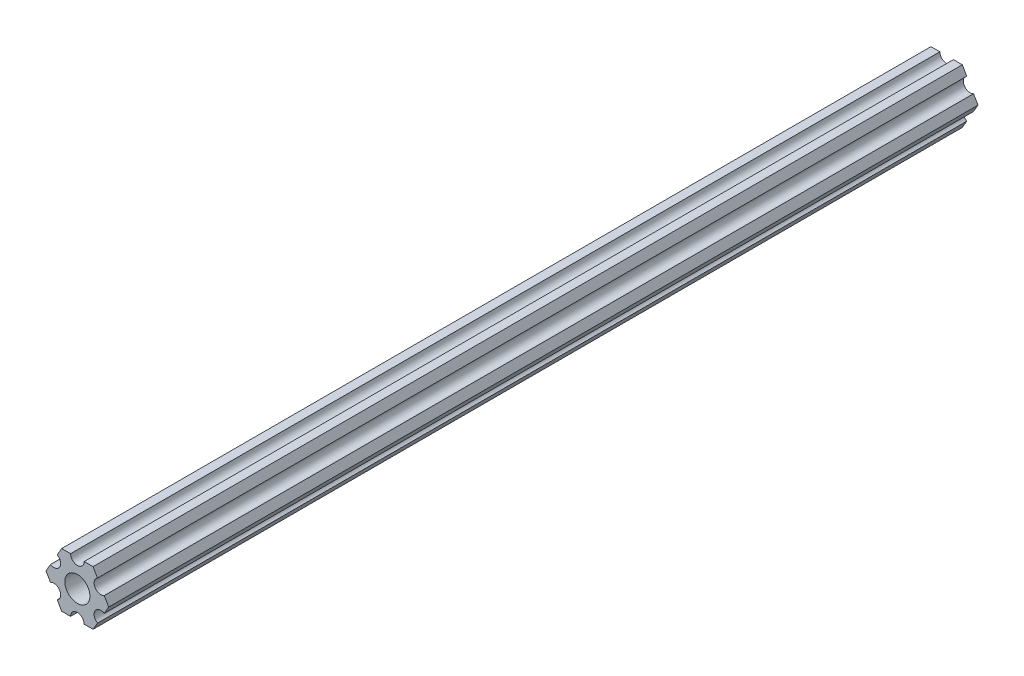
ISO-10303-21;
HEADER;
FILE_DESCRIPTION(('STEP AP214'),'2;1');
FILE_NAME('part.step','',(''),(''),'','','');
FILE_SCHEMA(('AUTOMOTIVE_DESIGN { 1 0 10303 214 1 1 1 1 }'));
ENDSEC;
DATA;
#1=APPLICATION_CONTEXT('core data for automotive mechanical design processes');
#2=APPLICATION_PROTOCOL_DEFINITION('international standard','automotive_design',2000,#1);
#3=PRODUCT_CONTEXT('',#1,'mechanical');
#4=PRODUCT('Part','Part','',(#3));
#5=PRODUCT_RELATED_PRODUCT_CATEGORY('part','',(#4));
#6=PRODUCT_DEFINITION_FORMATION('','',#4);
#7=PRODUCT_DEFINITION_CONTEXT('part definition',#1,'design');
#8=PRODUCT_DEFINITION('design','',#6,#7);
#9=PRODUCT_DEFINITION_SHAPE('','',#8);
#10=(LENGTH_UNIT() NAMED_UNIT(*) SI_UNIT(.MILLI.,.METRE.));
#11=(NAMED_UNIT(*) PLANE_ANGLE_UNIT() SI_UNIT($,.RADIAN.));
#12=(NAMED_UNIT(*) SI_UNIT($,.STERADIAN.) SOLID_ANGLE_UNIT());
#13=UNCERTAINTY_MEASURE_WITH_UNIT(LENGTH_MEASURE(1.E-05),#10,'distance_accuracy_value','');
#14=(GEOMETRIC_REPRESENTATION_CONTEXT(3) GLOBAL_UNCERTAINTY_ASSIGNED_CONTEXT((#13)) GLOBAL_UNIT_ASSIGNED_CONTEXT((#10,
#11,#12)) REPRESENTATION_CONTEXT('',''));
#15=CARTESIAN_POINT('',(0.,0.,0.));
#16=DIRECTION('',(0.,0.,1.));
#17=DIRECTION('',(1.,0.,0.));
#18=AXIS2_PLACEMENT_3D('',#15,#16,#17);
#19=CARTESIAN_POINT('',(-5.49926150638083,-3.17499966684068,-203.2));
#20=DIRECTION('',(0.,0.,1.));
#21=DIRECTION('',(1.,0.,0.));
#22=AXIS2_PLACEMENT_3D('',#19,#20,#21);
#23=CYLINDRICAL_SURFACE('',#22,1.58750000000001);
#24=CARTESIAN_POINT('',(-5.49926150638083,-3.17499966684068,0.));
#25=DIRECTION('',(0.,0.,-1.));
#26=DIRECTION('',(-1.,0.,0.));
#27=AXIS2_PLACEMENT_3D('',#24,#25,#26);
#28=CIRCLE('',#27,1.58750000000001);
#29=CARTESIAN_POINT('',(-6.29301142309098,-1.80018429024546,0.));
#30=VERTEX_POINT('',#29);
#31=CARTESIAN_POINT('',(-4.70551158967068,-4.54981504343589,0.));
#32=VERTEX_POINT('',#31);
#33=EDGE_CURVE('E194',#30,#32,#28,.T.);
#34=ORIENTED_EDGE('',*,*,#33,.F.);
#35=DIRECTION('',(0.,0.,1.));
#36=VECTOR('',#35,1.);
#37=CARTESIAN_POINT('',(-6.29301142309098,-1.80018429024546,-203.2));
#38=LINE('',#37,#36);
#39=CARTESIAN_POINT('',(-6.29301142309098,-1.80018429024546,-203.2));
#40=VERTEX_POINT('',#39);
#41=EDGE_CURVE('E11',#40,#30,#38,.T.);
#42=ORIENTED_EDGE('',*,*,#41,.F.);
#43=CARTESIAN_POINT('',(-5.49926150638083,-3.17499966684068,-203.2));
#44=DIRECTION('',(0.,0.,-1.));
#45=DIRECTION('',(-1.,0.,0.));
#46=AXIS2_PLACEMENT_3D('',#43,#44,#45);
#47=CIRCLE('',#46,1.58750000000001);
#48=CARTESIAN_POINT('',(-4.70551158967068,-4.54981504343589,-203.2));
#49=VERTEX_POINT('',#48);
#50=EDGE_CURVE('E245',#40,#49,#47,.T.);
#51=ORIENTED_EDGE('',*,*,#50,.T.);
#52=DIRECTION('',(0.,0.,1.));
#53=VECTOR('',#52,1.);
#54=CARTESIAN_POINT('',(-4.70551158967068,-4.54981504343589,-203.2));
#55=LINE('',#54,#53);
#56=EDGE_CURVE('E40',#49,#32,#55,.T.);
#57=ORIENTED_EDGE('',*,*,#56,.T.);
#58=EDGE_LOOP('',(#34,#42,#51,#57));
#59=FACE_BOUND('',#58,.T.);
#60=ADVANCED_FACE('F37',(#59),#23,.F.);
#61=CARTESIAN_POINT('',(-7.33234841870826,4.44212518856872E-07,-203.2));
#62=DIRECTION('',(-0.866025434075723,-0.499999947533953,0.));
#63=DIRECTION('',(0.499999947533953,-0.866025434075723,0.));
#64=AXIS2_PLACEMENT_3D('',#61,#62,#63);
#65=PLANE('',#64);
#66=DIRECTION('',(0.499999947533953,-0.866025434075723,0.));
#67=VECTOR('',#66,1.);
#68=CARTESIAN_POINT('',(-7.33234841870826,4.44212518856872E-07,0.));
#69=LINE('',#68,#67);
#70=CARTESIAN_POINT('',(-7.33234841870826,4.44212518856872E-07,0.));
#71=VERTEX_POINT('',#70);
#72=EDGE_CURVE('E243',#71,#30,#69,.T.);
#73=ORIENTED_EDGE('',*,*,#72,.F.);
#74=DIRECTION('',(0.,0.,1.));
#75=VECTOR('',#74,1.);
#76=CARTESIAN_POINT('',(-7.33234841870826,4.44212518856872E-07,-203.2));
#77=LINE('',#76,#75);
#78=CARTESIAN_POINT('',(-7.33234841870826,4.44212518856872E-07,-203.2));
#79=VERTEX_POINT('',#78);
#80=EDGE_CURVE('E46',#79,#71,#77,.T.);
#81=ORIENTED_EDGE('',*,*,#80,.F.);
#82=DIRECTION('',(0.499999947533953,-0.866025434075723,0.));
#83=VECTOR('',#82,1.);
#84=CARTESIAN_POINT('',(-7.33234841870826,4.44212518856872E-07,-203.2));
#85=LINE('',#84,#83);
#86=EDGE_CURVE('E184',#79,#40,#85,.T.);
#87=ORIENTED_EDGE('',*,*,#86,.T.);
#88=ORIENTED_EDGE('',*,*,#41,.T.);
#89=EDGE_LOOP('',(#73,#81,#87,#88));
#90=FACE_BOUND('',#89,.T.);
#91=ADVANCED_FACE('F277',(#90),#65,.T.);
#92=CARTESIAN_POINT('',(-6.29301120497139,1.80018505273895,-203.2));
#93=DIRECTION('',(-0.866025373493145,0.500000052466056,0.));
#94=DIRECTION('',(-0.500000052466056,-0.866025373493145,0.));
#95=AXIS2_PLACEMENT_3D('',#92,#93,#94);
#96=PLANE('',#95);
#97=DIRECTION('',(-0.500000052466056,-0.866025373493145,0.));
#98=VECTOR('',#97,1.);
#99=CARTESIAN_POINT('',(-6.29301120497139,1.80018505273895,0.));
#100=LINE('',#99,#98);
#101=CARTESIAN_POINT('',(-6.29301120497139,1.80018505273895,0.));
#102=VERTEX_POINT('',#101);
#103=EDGE_CURVE('E171',#102,#71,#100,.T.);
#104=ORIENTED_EDGE('',*,*,#103,.F.);
#105=DIRECTION('',(0.,0.,1.));
#106=VECTOR('',#105,1.);
#107=CARTESIAN_POINT('',(-6.29301120497139,1.80018505273895,-203.2));
#108=LINE('',#107,#106);
#109=CARTESIAN_POINT('',(-6.29301120497139,1.80018505273895,-203.2));
#110=VERTEX_POINT('',#109);
#111=EDGE_CURVE('E166',#110,#102,#108,.T.);
#112=ORIENTED_EDGE('',*,*,#111,.F.);
#113=DIRECTION('',(-0.500000052466056,-0.866025373493145,0.));
#114=VECTOR('',#113,1.);
#115=CARTESIAN_POINT('',(-6.29301120497139,1.80018505273895,-203.2));
#116=LINE('',#115,#114);
#117=EDGE_CURVE('E169',#110,#79,#116,.T.);
#118=ORIENTED_EDGE('',*,*,#117,.T.);
#119=ORIENTED_EDGE('',*,*,#80,.T.);
#120=EDGE_LOOP('',(#104,#112,#118,#119));
#121=FACE_BOUND('',#120,.T.);
#122=ADVANCED_FACE('F168',(#121),#96,.T.);
#123=CARTESIAN_POINT('',(-5.49926112168152,3.17500033315931,-203.2));
#124=DIRECTION('',(0.,0.,1.));
#125=DIRECTION('',(1.,0.,0.));
#126=AXIS2_PLACEMENT_3D('',#123,#124,#125);
#127=CYLINDRICAL_SURFACE('',#126,1.5875);
#128=CARTESIAN_POINT('',(-5.49926112168152,3.17500033315931,0.));
#129=DIRECTION('',(0.,0.,-1.));
#130=DIRECTION('',(-1.,0.,0.));
#131=AXIS2_PLACEMENT_3D('',#128,#129,#130);
#132=CIRCLE('',#131,1.5875);
#133=CARTESIAN_POINT('',(-4.70551103839166,4.54981561357968,0.));
#134=VERTEX_POINT('',#133);
#135=EDGE_CURVE('E240',#134,#102,#132,.T.);
#136=ORIENTED_EDGE('',*,*,#135,.F.);
#137=DIRECTION('',(0.,0.,1.));
#138=VECTOR('',#137,1.);
#139=CARTESIAN_POINT('',(-4.70551103839166,4.54981561357968,-203.2));
#140=LINE('',#139,#138);
#141=CARTESIAN_POINT('',(-4.70551103839166,4.54981561357968,-203.2));
#142=VERTEX_POINT('',#141);
#143=EDGE_CURVE('E176',#142,#134,#140,.T.);
#144=ORIENTED_EDGE('',*,*,#143,.F.);
#145=CARTESIAN_POINT('',(-5.49926112168152,3.17500033315931,-203.2));
#146=DIRECTION('',(0.,0.,-1.));
#147=DIRECTION('',(-1.,0.,0.));
#148=AXIS2_PLACEMENT_3D('',#145,#146,#147);
#149=CIRCLE('',#148,1.5875);
#150=EDGE_CURVE('E182',#142,#110,#149,.T.);
#151=ORIENTED_EDGE('',*,*,#150,.T.);
#152=ORIENTED_EDGE('',*,*,#111,.T.);
#153=EDGE_LOOP('',(#136,#144,#151,#152));
#154=FACE_BOUND('',#153,.T.);
#155=ADVANCED_FACE('F186',(#154),#127,.F.);
#156=CARTESIAN_POINT('',(-3.66617382465472,6.35000022210622,-203.2));
#157=DIRECTION('',(-0.866025373493145,0.500000052466056,0.));
#158=DIRECTION('',(-0.500000052466056,-0.866025373493145,0.));
#159=AXIS2_PLACEMENT_3D('',#156,#157,#158);
#160=PLANE('',#159);
#161=DIRECTION('',(-0.500000052466056,-0.866025373493145,0.));
#162=VECTOR('',#161,1.);
#163=CARTESIAN_POINT('',(-3.66617382465472,6.35000022210622,0.));
#164=LINE('',#163,#162);
#165=CARTESIAN_POINT('',(-3.66617382465472,6.35000022210622,0.));
#166=VERTEX_POINT('',#165);
#167=EDGE_CURVE('E237',#166,#134,#164,.T.);
#168=ORIENTED_EDGE('',*,*,#167,.F.);
#169=DIRECTION('',(0.,0.,1.));
#170=VECTOR('',#169,1.);
#171=CARTESIAN_POINT('',(-3.66617382465472,6.35000022210622,-203.2));
#172=LINE('',#171,#170);
#173=CARTESIAN_POINT('',(-3.66617382465472,6.35000022210622,-203.2));
#174=VERTEX_POINT('',#173);
#175=EDGE_CURVE('E249',#174,#166,#172,.T.);
#176=ORIENTED_EDGE('',*,*,#175,.F.);
#177=DIRECTION('',(-0.500000052466056,-0.866025373493145,0.));
#178=VECTOR('',#177,1.);
#179=CARTESIAN_POINT('',(-3.66617382465472,6.35000022210622,-203.2));
#180=LINE('',#179,#178);
#181=EDGE_CURVE('E187',#174,#142,#180,.T.);
#182=ORIENTED_EDGE('',*,*,#181,.T.);
#183=ORIENTED_EDGE('',*,*,#143,.T.);
#184=EDGE_LOOP('',(#168,#176,#182,#183));
#185=FACE_BOUND('',#184,.T.);
#186=ADVANCED_FACE('F290',(#185),#160,.T.);
#187=CARTESIAN_POINT('',(-1.58749884590197,6.35000022210623,-203.2));
#188=DIRECTION('',(0.,1.,0.));
#189=DIRECTION('',(-1.,0.,0.));
#190=AXIS2_PLACEMENT_3D('',#187,#188,#189);
#191=PLANE('',#190);
#192=DIRECTION('',(-1.,0.,0.));
#193=VECTOR('',#192,1.);
#194=CARTESIAN_POINT('',(-1.58749884590197,6.35000022210623,0.));
#195=LINE('',#194,#193);
#196=CARTESIAN_POINT('',(-1.58749884590197,6.35000022210623,0.));
#197=VERTEX_POINT('',#196);
#198=EDGE_CURVE('E234',#197,#166,#195,.T.);
#199=ORIENTED_EDGE('',*,*,#198,.F.);
#200=DIRECTION('',(0.,0.,1.));
#201=VECTOR('',#200,1.);
#202=CARTESIAN_POINT('',(-1.58749884590197,6.35000022210623,-203.2));
#203=LINE('',#202,#201);
#204=CARTESIAN_POINT('',(-1.58749884590197,6.35000022210623,-203.2));
#205=VERTEX_POINT('',#204);
#206=EDGE_CURVE('E251',#205,#197,#203,.T.);
#207=ORIENTED_EDGE('',*,*,#206,.F.);
#208=DIRECTION('',(-1.,0.,0.));
#209=VECTOR('',#208,1.);
#210=CARTESIAN_POINT('',(-1.58749884590197,6.35000022210623,-203.2));
#211=LINE('',#210,#209);
#212=EDGE_CURVE('E189',#205,#174,#211,.T.);
#213=ORIENTED_EDGE('',*,*,#212,.T.);
#214=ORIENTED_EDGE('',*,*,#175,.T.);
#215=EDGE_LOOP('',(#199,#207,#213,#214));
#216=FACE_BOUND('',#215,.T.);
#217=ADVANCED_FACE('F293',(#216),#191,.T.);
#218=CARTESIAN_POINT('',(3.84699344941095E-07,6.35000022210623,-203.2));
#219=DIRECTION('',(0.,0.,1.));
#220=DIRECTION('',(1.,0.,0.));
#221=AXIS2_PLACEMENT_3D('',#218,#219,#220);
#222=CYLINDRICAL_SURFACE('',#221,1.58749884590197);
#223=CARTESIAN_POINT('',(3.84699344941095E-07,6.35000022210623,0.));
#224=DIRECTION('',(0.,0.,-1.));
#225=DIRECTION('',(-1.,0.,0.));
#226=AXIS2_PLACEMENT_3D('',#223,#224,#225);
#227=CIRCLE('',#226,1.58749884590197);
#228=CARTESIAN_POINT('',(1.58749923060131,6.35000022210623,0.));
#229=VERTEX_POINT('',#228);
#230=EDGE_CURVE('E231',#229,#197,#227,.T.);
#231=ORIENTED_EDGE('',*,*,#230,.F.);
#232=DIRECTION('',(0.,0.,1.));
#233=VECTOR('',#232,1.);
#234=CARTESIAN_POINT('',(1.58749923060131,6.35000022210623,-203.2));
#235=LINE('',#234,#233);
#236=CARTESIAN_POINT('',(1.58749923060131,6.35000022210623,-203.2));
#237=VERTEX_POINT('',#236);
#238=EDGE_CURVE('E253',#237,#229,#235,.T.);
#239=ORIENTED_EDGE('',*,*,#238,.F.);
#240=CARTESIAN_POINT('',(3.84699344941095E-07,6.35000022210623,-203.2));
#241=DIRECTION('',(0.,0.,-1.));
#242=DIRECTION('',(-1.,0.,0.));
#243=AXIS2_PLACEMENT_3D('',#240,#241,#242);
#244=CIRCLE('',#243,1.58749884590197);
#245=EDGE_CURVE('E398',#237,#205,#244,.T.);
#246=ORIENTED_EDGE('',*,*,#245,.T.);
#247=ORIENTED_EDGE('',*,*,#206,.T.);
#248=EDGE_LOOP('',(#231,#239,#246,#247));
#249=FACE_BOUND('',#248,.T.);
#250=ADVANCED_FACE('F297',(#249),#222,.F.);
#251=CARTESIAN_POINT('',(3.66617452134701,6.35000022210623,-203.2));
#252=DIRECTION('',(0.,1.,0.));
#253=DIRECTION('',(-1.,0.,0.));
#254=AXIS2_PLACEMENT_3D('',#251,#252,#253);
#255=PLANE('',#254);
#256=DIRECTION('',(-1.,0.,0.));
#257=VECTOR('',#256,1.);
#258=CARTESIAN_POINT('',(3.66617452134701,6.35000022210623,0.));
#259=LINE('',#258,#257);
#260=CARTESIAN_POINT('',(3.66617452134701,6.35000022210623,0.));
#261=VERTEX_POINT('',#260);
#262=EDGE_CURVE('E228',#261,#229,#259,.T.);
#263=ORIENTED_EDGE('',*,*,#262,.F.);
#264=DIRECTION('',(0.,0.,1.));
#265=VECTOR('',#264,1.);
#266=CARTESIAN_POINT('',(3.66617452134701,6.35000022210623,-203.2));
#267=LINE('',#266,#265);
#268=CARTESIAN_POINT('',(3.66617452134701,6.35000022210623,-203.2));
#269=VERTEX_POINT('',#268);
#270=EDGE_CURVE('E255',#269,#261,#267,.T.);
#271=ORIENTED_EDGE('',*,*,#270,.F.);
#272=DIRECTION('',(-1.,0.,0.));
#273=VECTOR('',#272,1.);
#274=CARTESIAN_POINT('',(3.66617452134701,6.35000022210623,-203.2));
#275=LINE('',#274,#273);
#276=EDGE_CURVE('E395',#269,#237,#275,.T.);
#277=ORIENTED_EDGE('',*,*,#276,.T.);
#278=ORIENTED_EDGE('',*,*,#238,.T.);
#279=EDGE_LOOP('',(#263,#271,#277,#278));
#280=FACE_BOUND('',#279,.T.);
#281=ADVANCED_FACE('F301',(#280),#255,.T.);
#282=CARTESIAN_POINT('',(4.70551142760333,4.54981551649452,-203.2));
#283=DIRECTION('',(0.866025449221368,0.499999921300922,0.));
#284=DIRECTION('',(-0.499999921300922,0.866025449221368,0.));
#285=AXIS2_PLACEMENT_3D('',#282,#283,#284);
#286=PLANE('',#285);
#287=DIRECTION('',(-0.499999921300922,0.866025449221368,0.));
#288=VECTOR('',#287,1.);
#289=CARTESIAN_POINT('',(4.70551142760333,4.54981551649452,0.));
#290=LINE('',#289,#288);
#291=CARTESIAN_POINT('',(4.70551142760333,4.54981551649452,0.));
#292=VERTEX_POINT('',#291);
#293=EDGE_CURVE('E225',#292,#261,#290,.T.);
#294=ORIENTED_EDGE('',*,*,#293,.F.);
#295=DIRECTION('',(0.,0.,1.));
#296=VECTOR('',#295,1.);
#297=CARTESIAN_POINT('',(4.70551142760333,4.54981551649452,-203.2));
#298=LINE('',#297,#296);
#299=CARTESIAN_POINT('',(4.70551142760333,4.54981551649452,-203.2));
#300=VERTEX_POINT('',#299);
#301=EDGE_CURVE('E257',#300,#292,#298,.T.);
#302=ORIENTED_EDGE('',*,*,#301,.F.);
#303=DIRECTION('',(-0.499999921300922,0.866025449221368,0.));
#304=VECTOR('',#303,1.);
#305=CARTESIAN_POINT('',(4.70551142760333,4.54981551649452,-203.2));
#306=LINE('',#305,#304);
#307=EDGE_CURVE('E392',#300,#269,#306,.T.);
#308=ORIENTED_EDGE('',*,*,#307,.T.);
#309=ORIENTED_EDGE('',*,*,#270,.T.);
#310=EDGE_LOOP('',(#294,#302,#308,#309));
#311=FACE_BOUND('',#310,.T.);
#312=ADVANCED_FACE('F305',(#311),#286,.T.);
#313=CARTESIAN_POINT('',(5.49926130266854,3.1750001158556,-203.2));
#314=DIRECTION('',(0.,0.,1.));
#315=DIRECTION('',(1.,0.,0.));
#316=AXIS2_PLACEMENT_3D('',#313,#314,#315);
#317=CYLINDRICAL_SURFACE('',#316,1.5875);
#318=CARTESIAN_POINT('',(5.49926130266854,3.1750001158556,0.));
#319=DIRECTION('',(0.,0.,-1.));
#320=DIRECTION('',(-1.,0.,0.));
#321=AXIS2_PLACEMENT_3D('',#318,#319,#320);
#322=CIRCLE('',#321,1.5875);
#323=CARTESIAN_POINT('',(6.29301117773375,1.80018471521667,0.));
#324=VERTEX_POINT('',#323);
#325=EDGE_CURVE('E222',#324,#292,#322,.T.);
#326=ORIENTED_EDGE('',*,*,#325,.F.);
#327=DIRECTION('',(0.,0.,1.));
#328=VECTOR('',#327,1.);
#329=CARTESIAN_POINT('',(6.29301117773375,1.80018471521667,-203.2));
#330=LINE('',#329,#328);
#331=CARTESIAN_POINT('',(6.29301117773375,1.80018471521667,-203.2));
#332=VERTEX_POINT('',#331);
#333=EDGE_CURVE('E259',#332,#324,#330,.T.);
#334=ORIENTED_EDGE('',*,*,#333,.F.);
#335=CARTESIAN_POINT('',(5.49926130266854,3.1750001158556,-203.2));
#336=DIRECTION('',(0.,0.,-1.));
#337=DIRECTION('',(-1.,0.,0.));
#338=AXIS2_PLACEMENT_3D('',#335,#336,#337);
#339=CIRCLE('',#338,1.5875);
#340=EDGE_CURVE('E389',#332,#300,#339,.T.);
#341=ORIENTED_EDGE('',*,*,#340,.T.);
#342=ORIENTED_EDGE('',*,*,#301,.T.);
#343=EDGE_LOOP('',(#326,#334,#341,#342));
#344=FACE_BOUND('',#343,.T.);
#345=ADVANCED_FACE('F309',(#344),#317,.F.);
#346=CARTESIAN_POINT('',(7.33234803400895,9.61748368946088E-08,-203.2));
#347=DIRECTION('',(0.866025449221368,0.499999921300922,0.));
#348=DIRECTION('',(-0.499999921300922,0.866025449221368,0.));
#349=AXIS2_PLACEMENT_3D('',#346,#347,#348);
#350=PLANE('',#349);
#351=DIRECTION('',(-0.499999921300922,0.866025449221368,0.));
#352=VECTOR('',#351,1.);
#353=CARTESIAN_POINT('',(7.33234803400895,9.61748368946088E-08,0.));
#354=LINE('',#353,#352);
#355=CARTESIAN_POINT('',(7.33234803400895,9.61748368946088E-08,0.));
#356=VERTEX_POINT('',#355);
#357=EDGE_CURVE('E219',#356,#324,#354,.T.);
#358=ORIENTED_EDGE('',*,*,#357,.F.);
#359=DIRECTION('',(0.,0.,1.));
#360=VECTOR('',#359,1.);
#361=CARTESIAN_POINT('',(7.33234803400895,9.61748368946088E-08,-203.2));
#362=LINE('',#361,#360);
#363=CARTESIAN_POINT('',(7.33234803400895,9.61748368946088E-08,-203.2));
#364=VERTEX_POINT('',#363);
#365=EDGE_CURVE('E261',#364,#356,#362,.T.);
#366=ORIENTED_EDGE('',*,*,#365,.F.);
#367=DIRECTION('',(-0.499999921300922,0.866025449221368,0.));
#368=VECTOR('',#367,1.);
#369=CARTESIAN_POINT('',(7.33234803400895,9.61748368946088E-08,-203.2));
#370=LINE('',#369,#368);
#371=EDGE_CURVE('E386',#364,#332,#370,.T.);
#372=ORIENTED_EDGE('',*,*,#371,.T.);
#373=ORIENTED_EDGE('',*,*,#333,.T.);
#374=EDGE_LOOP('',(#358,#366,#372,#373));
#375=FACE_BOUND('',#374,.T.);
#376=ADVANCED_FACE('F313',(#375),#350,.T.);
#377=CARTESIAN_POINT('',(6.29301092933191,-1.80018457531732,-203.2));
#378=DIRECTION('',(0.866025403784438,-0.5,0.));
#379=DIRECTION('',(0.5,0.866025403784438,0.));
#380=AXIS2_PLACEMENT_3D('',#377,#378,#379);
#381=PLANE('',#380);
#382=DIRECTION('',(0.5,0.866025403784438,0.));
#383=VECTOR('',#382,1.);
#384=CARTESIAN_POINT('',(6.29301092933191,-1.80018457531732,0.));
#385=LINE('',#384,#383);
#386=CARTESIAN_POINT('',(6.29301092933191,-1.80018457531732,0.));
#387=VERTEX_POINT('',#386);
#388=EDGE_CURVE('E216',#387,#356,#385,.T.);
#389=ORIENTED_EDGE('',*,*,#388,.F.);
#390=DIRECTION('',(0.,0.,1.));
#391=VECTOR('',#390,1.);
#392=CARTESIAN_POINT('',(6.29301092933191,-1.80018457531732,-203.2));
#393=LINE('',#392,#391);
#394=CARTESIAN_POINT('',(6.29301092933191,-1.80018457531732,-203.2));
#395=VERTEX_POINT('',#394);
#396=EDGE_CURVE('E263',#395,#387,#393,.T.);
#397=ORIENTED_EDGE('',*,*,#396,.F.);
#398=DIRECTION('',(0.5,0.866025403784438,0.));
#399=VECTOR('',#398,1.);
#400=CARTESIAN_POINT('',(6.29301092933191,-1.80018457531732,-203.2));
#401=LINE('',#400,#399);
#402=EDGE_CURVE('E383',#395,#364,#401,.T.);
#403=ORIENTED_EDGE('',*,*,#402,.T.);
#404=ORIENTED_EDGE('',*,*,#365,.T.);
#405=EDGE_LOOP('',(#389,#397,#403,#404));
#406=FACE_BOUND('',#405,.T.);
#407=ADVANCED_FACE('F317',(#406),#381,.T.);
#408=CARTESIAN_POINT('',(5.49926092933191,-3.17499990382512,-203.2));
#409=DIRECTION('',(0.,0.,1.));
#410=DIRECTION('',(1.,0.,0.));
#411=AXIS2_PLACEMENT_3D('',#408,#409,#410);
#412=CYLINDRICAL_SURFACE('',#411,1.5875);
#413=CARTESIAN_POINT('',(5.49926092933191,-3.17499990382512,0.));
#414=DIRECTION('',(0.,0.,-1.));
#415=DIRECTION('',(-1.,0.,0.));
#416=AXIS2_PLACEMENT_3D('',#413,#414,#415);
#417=CIRCLE('',#416,1.5875);
#418=CARTESIAN_POINT('',(4.70551092933191,-4.54981523233291,0.));
#419=VERTEX_POINT('',#418);
#420=EDGE_CURVE('E213',#419,#387,#417,.T.);
#421=ORIENTED_EDGE('',*,*,#420,.F.);
#422=DIRECTION('',(0.,0.,1.));
#423=VECTOR('',#422,1.);
#424=CARTESIAN_POINT('',(4.70551092933191,-4.54981523233291,-203.2));
#425=LINE('',#424,#423);
#426=CARTESIAN_POINT('',(4.70551092933191,-4.54981523233291,-203.2));
#427=VERTEX_POINT('',#426);
#428=EDGE_CURVE('E265',#427,#419,#425,.T.);
#429=ORIENTED_EDGE('',*,*,#428,.F.);
#430=CARTESIAN_POINT('',(5.49926092933191,-3.17499990382512,-203.2));
#431=DIRECTION('',(0.,0.,-1.));
#432=DIRECTION('',(-1.,0.,0.));
#433=AXIS2_PLACEMENT_3D('',#430,#431,#432);
#434=CIRCLE('',#433,1.5875);
#435=EDGE_CURVE('E380',#427,#395,#434,.T.);
#436=ORIENTED_EDGE('',*,*,#435,.T.);
#437=ORIENTED_EDGE('',*,*,#396,.T.);
#438=EDGE_LOOP('',(#421,#429,#436,#437));
#439=FACE_BOUND('',#438,.T.);
#440=ADVANCED_FACE('F321',(#439),#412,.F.);
#441=CARTESIAN_POINT('',(3.66617382465481,-6.34999990382519,-203.2));
#442=DIRECTION('',(0.866025403784438,-0.5,0.));
#443=DIRECTION('',(0.5,0.866025403784439,0.));
#444=AXIS2_PLACEMENT_3D('',#441,#442,#443);
#445=PLANE('',#444);
#446=DIRECTION('',(0.5,0.866025403784439,0.));
#447=VECTOR('',#446,1.);
#448=CARTESIAN_POINT('',(3.66617382465481,-6.34999990382519,0.));
#449=LINE('',#448,#447);
#450=CARTESIAN_POINT('',(3.66617382465481,-6.34999990382519,0.));
#451=VERTEX_POINT('',#450);
#452=EDGE_CURVE('E210',#451,#419,#449,.T.);
#453=ORIENTED_EDGE('',*,*,#452,.F.);
#454=DIRECTION('',(0.,0.,1.));
#455=VECTOR('',#454,1.);
#456=CARTESIAN_POINT('',(3.66617382465481,-6.34999990382519,-203.2));
#457=LINE('',#456,#455);
#458=CARTESIAN_POINT('',(3.66617382465481,-6.34999990382519,-203.2));
#459=VERTEX_POINT('',#458);
#460=EDGE_CURVE('E267',#459,#451,#457,.T.);
#461=ORIENTED_EDGE('',*,*,#460,.F.);
#462=DIRECTION('',(0.5,0.866025403784439,0.));
#463=VECTOR('',#462,1.);
#464=CARTESIAN_POINT('',(3.66617382465481,-6.34999990382519,-203.2));
#465=LINE('',#464,#463);
#466=EDGE_CURVE('E377',#459,#427,#465,.T.);
#467=ORIENTED_EDGE('',*,*,#466,.T.);
#468=ORIENTED_EDGE('',*,*,#428,.T.);
#469=EDGE_LOOP('',(#453,#461,#467,#468));
#470=FACE_BOUND('',#469,.T.);
#471=ADVANCED_FACE('F325',(#470),#445,.T.);
#472=CARTESIAN_POINT('',(1.58750115409778,-6.34999990382519,-203.2));
#473=DIRECTION('',(0.,-1.,0.));
#474=DIRECTION('',(1.,0.,0.));
#475=AXIS2_PLACEMENT_3D('',#472,#473,#474);
#476=PLANE('',#475);
#477=DIRECTION('',(1.,0.,0.));
#478=VECTOR('',#477,1.);
#479=CARTESIAN_POINT('',(1.58750115409778,-6.34999990382519,0.));
#480=LINE('',#479,#478);
#481=CARTESIAN_POINT('',(1.58750115409778,-6.34999990382519,0.));
#482=VERTEX_POINT('',#481);
#483=EDGE_CURVE('E207',#482,#451,#480,.T.);
#484=ORIENTED_EDGE('',*,*,#483,.F.);
#485=DIRECTION('',(0.,0.,1.));
#486=VECTOR('',#485,1.);
#487=CARTESIAN_POINT('',(1.58750115409778,-6.34999990382519,-203.2));
#488=LINE('',#487,#486);
#489=CARTESIAN_POINT('',(1.58750115409778,-6.34999990382519,-203.2));
#490=VERTEX_POINT('',#489);
#491=EDGE_CURVE('E269',#490,#482,#488,.T.);
#492=ORIENTED_EDGE('',*,*,#491,.F.);
#493=DIRECTION('',(1.,0.,0.));
#494=VECTOR('',#493,1.);
#495=CARTESIAN_POINT('',(1.58750115409778,-6.34999990382519,-203.2));
#496=LINE('',#495,#494);
#497=EDGE_CURVE('E374',#490,#459,#496,.T.);
#498=ORIENTED_EDGE('',*,*,#497,.T.);
#499=ORIENTED_EDGE('',*,*,#460,.T.);
#500=EDGE_LOOP('',(#484,#492,#498,#499));
#501=FACE_BOUND('',#500,.T.);
#502=ADVANCED_FACE('F329',(#501),#476,.T.);
#503=CARTESIAN_POINT('',(-3.8469926204343E-07,-6.34999990382519,-203.2));
#504=DIRECTION('',(0.,0.,1.));
#505=DIRECTION('',(1.,0.,0.));
#506=AXIS2_PLACEMENT_3D('',#503,#504,#505);
#507=CYLINDRICAL_SURFACE('',#506,1.58750115409778);
#508=CARTESIAN_POINT('',(-3.8469926204343E-07,-6.34999990382519,0.));
#509=DIRECTION('',(0.,0.,-1.));
#510=DIRECTION('',(-1.,0.,0.));
#511=AXIS2_PLACEMENT_3D('',#508,#509,#510);
#512=CIRCLE('',#511,1.58750115409778);
#513=CARTESIAN_POINT('',(-1.58750153879705,-6.34999990382519,0.));
#514=VERTEX_POINT('',#513);
#515=EDGE_CURVE('E204',#514,#482,#512,.T.);
#516=ORIENTED_EDGE('',*,*,#515,.F.);
#517=DIRECTION('',(0.,0.,1.));
#518=VECTOR('',#517,1.);
#519=CARTESIAN_POINT('',(-1.58750153879705,-6.34999990382519,-203.2));
#520=LINE('',#519,#518);
#521=CARTESIAN_POINT('',(-1.58750153879705,-6.34999990382519,-203.2));
#522=VERTEX_POINT('',#521);
#523=EDGE_CURVE('E271',#522,#514,#520,.T.);
#524=ORIENTED_EDGE('',*,*,#523,.F.);
#525=CARTESIAN_POINT('',(-3.8469926204343E-07,-6.34999990382519,-203.2));
#526=DIRECTION('',(0.,0.,-1.));
#527=DIRECTION('',(-1.,0.,0.));
#528=AXIS2_PLACEMENT_3D('',#525,#526,#527);
#529=CIRCLE('',#528,1.58750115409778);
#530=EDGE_CURVE('E371',#522,#490,#529,.T.);
#531=ORIENTED_EDGE('',*,*,#530,.T.);
#532=ORIENTED_EDGE('',*,*,#491,.T.);
#533=EDGE_LOOP('',(#516,#524,#531,#532));
#534=FACE_BOUND('',#533,.T.);
#535=ADVANCED_FACE('F333',(#534),#507,.F.);
#536=CARTESIAN_POINT('',(-3.66617452134693,-6.34999990382519,-203.2));
#537=DIRECTION('',(0.,-1.,0.));
#538=DIRECTION('',(1.,0.,0.));
#539=AXIS2_PLACEMENT_3D('',#536,#537,#538);
#540=PLANE('',#539);
#541=DIRECTION('',(1.,0.,0.));
#542=VECTOR('',#541,1.);
#543=CARTESIAN_POINT('',(-3.66617452134693,-6.34999990382519,0.));
#544=LINE('',#543,#542);
#545=CARTESIAN_POINT('',(-3.66617452134693,-6.34999990382519,0.));
#546=VERTEX_POINT('',#545);
#547=EDGE_CURVE('E201',#546,#514,#544,.T.);
#548=ORIENTED_EDGE('',*,*,#547,.F.);
#549=DIRECTION('',(0.,0.,1.));
#550=VECTOR('',#549,1.);
#551=CARTESIAN_POINT('',(-3.66617452134693,-6.34999990382519,-203.2));
#552=LINE('',#551,#550);
#553=CARTESIAN_POINT('',(-3.66617452134693,-6.34999990382519,-203.2));
#554=VERTEX_POINT('',#553);
#555=EDGE_CURVE('E272',#554,#546,#552,.T.);
#556=ORIENTED_EDGE('',*,*,#555,.F.);
#557=DIRECTION('',(1.,0.,0.));
#558=VECTOR('',#557,1.);
#559=CARTESIAN_POINT('',(-3.66617452134693,-6.34999990382519,-203.2));
#560=LINE('',#559,#558);
#561=EDGE_CURVE('E368',#554,#522,#560,.T.);
#562=ORIENTED_EDGE('',*,*,#561,.T.);
#563=ORIENTED_EDGE('',*,*,#523,.T.);
#564=EDGE_LOOP('',(#548,#556,#562,#563));
#565=FACE_BOUND('',#564,.T.);
#566=ADVANCED_FACE('F337',(#565),#540,.T.);
#567=CARTESIAN_POINT('',(-4.70551158967068,-4.54981504343589,-203.2));
#568=DIRECTION('',(-0.866025434075723,-0.499999947533953,0.));
#569=DIRECTION('',(0.499999947533953,-0.866025434075723,0.));
#570=AXIS2_PLACEMENT_3D('',#567,#568,#569);
#571=PLANE('',#570);
#572=DIRECTION('',(0.499999947533953,-0.866025434075723,0.));
#573=VECTOR('',#572,1.);
#574=CARTESIAN_POINT('',(-4.70551158967068,-4.54981504343589,0.));
#575=LINE('',#574,#573);
#576=EDGE_CURVE('E197',#32,#546,#575,.T.);
#577=ORIENTED_EDGE('',*,*,#576,.F.);
#578=ORIENTED_EDGE('',*,*,#56,.F.);
#579=DIRECTION('',(0.499999947533953,-0.866025434075723,0.));
#580=VECTOR('',#579,1.);
#581=CARTESIAN_POINT('',(-4.70551158967068,-4.54981504343589,-203.2));
#582=LINE('',#581,#580);
#583=EDGE_CURVE('E366',#49,#554,#582,.T.);
#584=ORIENTED_EDGE('',*,*,#583,.T.);
#585=ORIENTED_EDGE('',*,*,#555,.T.);
#586=EDGE_LOOP('',(#577,#578,#584,#585));
#587=FACE_BOUND('',#586,.T.);
#588=ADVANCED_FACE('F274',(#587),#571,.T.);
#589=CARTESIAN_POINT('',(-5.49926150638083,-3.17499966684068,-203.2));
#590=DIRECTION('',(0.,0.,-1.));
#591=DIRECTION('',(-1.,0.,0.));
#592=AXIS2_PLACEMENT_3D('',#589,#590,#591);
#593=PLANE('',#592);
#594=CARTESIAN_POINT('',(0.,0.,-203.2));
#595=DIRECTION('',(0.,0.,1.));
#596=DIRECTION('',(-1.,0.,0.));
#597=AXIS2_PLACEMENT_3D('',#594,#595,#596);
#598=CIRCLE('',#597,2.9337);
#599=CARTESIAN_POINT('',(-2.9337,0.,-203.2));
#600=VERTEX_POINT('',#599);
#601=EDGE_CURVE('E198',#600,#600,#598,.T.);
#602=ORIENTED_EDGE('',*,*,#601,.T.);
#603=EDGE_LOOP('',(#602));
#604=FACE_BOUND('',#603,.T.);
#605=ORIENTED_EDGE('',*,*,#50,.F.);
#606=ORIENTED_EDGE('',*,*,#86,.F.);
#607=ORIENTED_EDGE('',*,*,#117,.F.);
#608=ORIENTED_EDGE('',*,*,#150,.F.);
#609=ORIENTED_EDGE('',*,*,#181,.F.);
#610=ORIENTED_EDGE('',*,*,#212,.F.);
#611=ORIENTED_EDGE('',*,*,#245,.F.);
#612=ORIENTED_EDGE('',*,*,#276,.F.);
#613=ORIENTED_EDGE('',*,*,#307,.F.);
#614=ORIENTED_EDGE('',*,*,#340,.F.);
#615=ORIENTED_EDGE('',*,*,#371,.F.);
#616=ORIENTED_EDGE('',*,*,#402,.F.);
#617=ORIENTED_EDGE('',*,*,#435,.F.);
#618=ORIENTED_EDGE('',*,*,#466,.F.);
#619=ORIENTED_EDGE('',*,*,#497,.F.);
#620=ORIENTED_EDGE('',*,*,#530,.F.);
#621=ORIENTED_EDGE('',*,*,#561,.F.);
#622=ORIENTED_EDGE('',*,*,#583,.F.);
#623=EDGE_LOOP('',(#605,#606,#607,#608,#609,#610,#611,#612,#613,#614,#615,#616,#617,#618,#619,
#620,#621,#622));
#624=FACE_BOUND('',#623,.T.);
#625=ADVANCED_FACE('F180',(#604,#624),#593,.T.);
#626=CARTESIAN_POINT('',(-5.49926150638083,-3.17499966684068,0.));
#627=DIRECTION('',(0.,0.,-1.));
#628=DIRECTION('',(-1.,0.,0.));
#629=AXIS2_PLACEMENT_3D('',#626,#627,#628);
#630=PLANE('',#629);
#631=CARTESIAN_POINT('',(0.,0.,0.));
#632=DIRECTION('',(0.,0.,1.));
#633=DIRECTION('',(-1.,0.,0.));
#634=AXIS2_PLACEMENT_3D('',#631,#632,#633);
#635=CIRCLE('',#634,2.9337);
#636=CARTESIAN_POINT('',(-2.9337,0.,0.));
#637=VERTEX_POINT('',#636);
#638=EDGE_CURVE('E361',#637,#637,#635,.T.);
#639=ORIENTED_EDGE('',*,*,#638,.F.);
#640=EDGE_LOOP('',(#639));
#641=FACE_BOUND('',#640,.T.);
#642=ORIENTED_EDGE('',*,*,#33,.T.);
#643=ORIENTED_EDGE('',*,*,#576,.T.);
#644=ORIENTED_EDGE('',*,*,#547,.T.);
#645=ORIENTED_EDGE('',*,*,#515,.T.);
#646=ORIENTED_EDGE('',*,*,#483,.T.);
#647=ORIENTED_EDGE('',*,*,#452,.T.);
#648=ORIENTED_EDGE('',*,*,#420,.T.);
#649=ORIENTED_EDGE('',*,*,#388,.T.);
#650=ORIENTED_EDGE('',*,*,#357,.T.);
#651=ORIENTED_EDGE('',*,*,#325,.T.);
#652=ORIENTED_EDGE('',*,*,#293,.T.);
#653=ORIENTED_EDGE('',*,*,#262,.T.);
#654=ORIENTED_EDGE('',*,*,#230,.T.);
#655=ORIENTED_EDGE('',*,*,#198,.T.);
#656=ORIENTED_EDGE('',*,*,#167,.T.);
#657=ORIENTED_EDGE('',*,*,#135,.T.);
#658=ORIENTED_EDGE('',*,*,#103,.T.);
#659=ORIENTED_EDGE('',*,*,#72,.T.);
#660=EDGE_LOOP('',(#642,#643,#644,#645,#646,#647,#648,#649,#650,#651,#652,#653,#654,#655,#656,
#657,#658,#659));
#661=FACE_BOUND('',#660,.T.);
#662=ADVANCED_FACE('F276',(#641,#661),#630,.F.);
#663=CARTESIAN_POINT('',(0.,0.,-203.2));
#664=DIRECTION('',(0.,0.,1.));
#665=DIRECTION('',(1.,0.,0.));
#666=AXIS2_PLACEMENT_3D('',#663,#664,#665);
#667=CYLINDRICAL_SURFACE('',#666,2.9337);
#668=ORIENTED_EDGE('',*,*,#601,.F.);
#669=EDGE_LOOP('',(#668));
#670=FACE_BOUND('',#669,.T.);
#671=ORIENTED_EDGE('',*,*,#638,.T.);
#672=EDGE_LOOP('',(#671));
#673=FACE_BOUND('',#672,.T.);
#674=ADVANCED_FACE('F349',(#670,#673),#667,.F.);
#675=CLOSED_SHELL('',(#60,#91,#122,#155,#186,#217,#250,#281,#312,#345,#376,#407,#440,#471,#502,
#535,#566,#588,#625,#662,#674));
#676=MANIFOLD_SOLID_BREP('B2',#675);
#677=ADVANCED_BREP_SHAPE_REPRESENTATION('',(#18,#676),#14);
#678=SHAPE_DEFINITION_REPRESENTATION(#9,#677);
ENDSEC;
END-ISO-10303-21;
